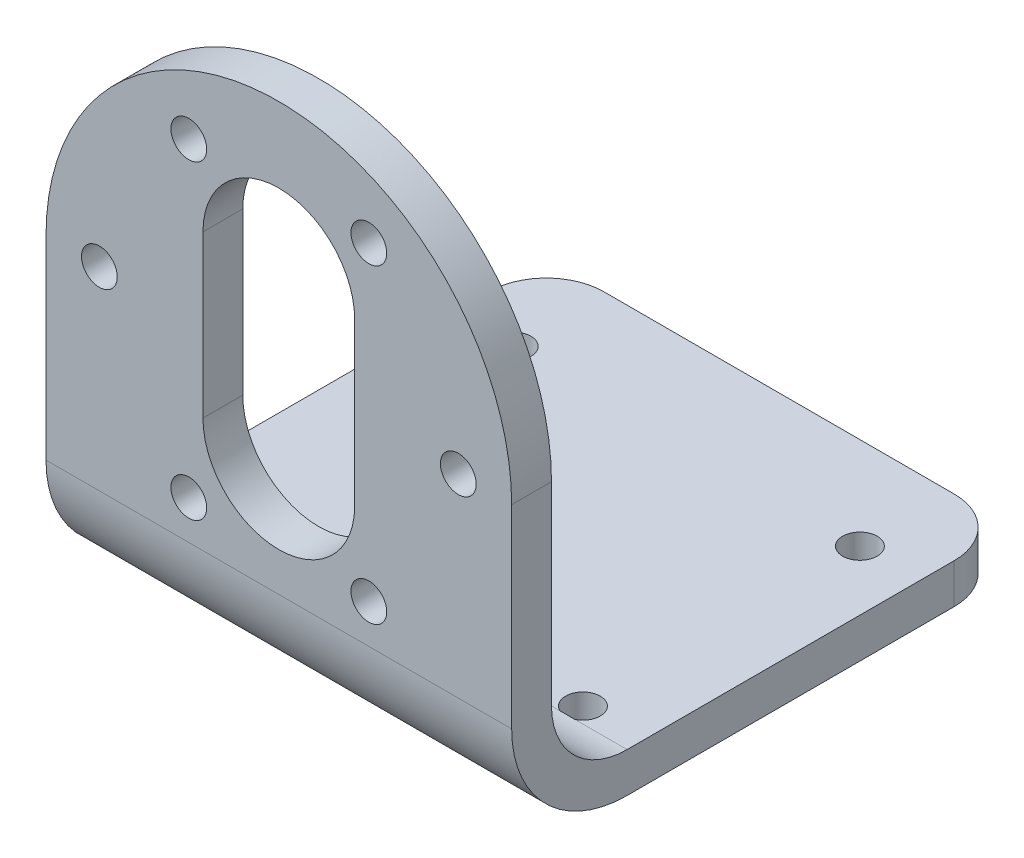
ISO-10303-21;
HEADER;
FILE_DESCRIPTION(('STEP AP214'),'2;1');
FILE_NAME('part.step','',(''),(''),'','','');
FILE_SCHEMA(('AUTOMOTIVE_DESIGN { 1 0 10303 214 1 1 1 1 }'));
ENDSEC;
DATA;
#1=APPLICATION_CONTEXT('core data for automotive mechanical design processes');
#2=APPLICATION_PROTOCOL_DEFINITION('international standard','automotive_design',2000,#1);
#3=PRODUCT_CONTEXT('',#1,'mechanical');
#4=PRODUCT('Part','Part','',(#3));
#5=PRODUCT_RELATED_PRODUCT_CATEGORY('part','',(#4));
#6=PRODUCT_DEFINITION_FORMATION('','',#4);
#7=PRODUCT_DEFINITION_CONTEXT('part definition',#1,'design');
#8=PRODUCT_DEFINITION('design','',#6,#7);
#9=PRODUCT_DEFINITION_SHAPE('','',#8);
#10=(LENGTH_UNIT() NAMED_UNIT(*) SI_UNIT(.MILLI.,.METRE.));
#11=(NAMED_UNIT(*) PLANE_ANGLE_UNIT() SI_UNIT($,.RADIAN.));
#12=(NAMED_UNIT(*) SI_UNIT($,.STERADIAN.) SOLID_ANGLE_UNIT());
#13=UNCERTAINTY_MEASURE_WITH_UNIT(LENGTH_MEASURE(1.E-05),#10,'distance_accuracy_value','');
#14=(GEOMETRIC_REPRESENTATION_CONTEXT(3) GLOBAL_UNCERTAINTY_ASSIGNED_CONTEXT((#13)) GLOBAL_UNIT_ASSIGNED_CONTEXT((#10,
#11,#12)) REPRESENTATION_CONTEXT('',''));
#15=CARTESIAN_POINT('',(0.,0.,0.));
#16=DIRECTION('',(0.,0.,1.));
#17=DIRECTION('',(1.,0.,0.));
#18=AXIS2_PLACEMENT_3D('',#15,#16,#17);
#19=CARTESIAN_POINT('',(-47.1412127925836,47.,50.783023222912));
#20=DIRECTION('',(0.,0.,-1.));
#21=DIRECTION('',(-1.,0.,0.));
#22=AXIS2_PLACEMENT_3D('',#19,#20,#21);
#23=PLANE('',#22);
#24=CARTESIAN_POINT('',(-19.1662127925836,13.3727697016443,50.783023222912));
#25=DIRECTION('',(0.,0.,1.));
#26=DIRECTION('',(1.,0.,0.));
#27=AXIS2_PLACEMENT_3D('',#24,#25,#26);
#28=CIRCLE('',#27,1.55);
#29=CARTESIAN_POINT('',(-17.6162127925836,13.3727697016443,50.783023222912));
#30=VERTEX_POINT('',#29);
#31=EDGE_CURVE('E802',#30,#30,#28,.F.);
#32=ORIENTED_EDGE('',*,*,#31,.T.);
#33=EDGE_LOOP('',(#32));
#34=FACE_BOUND('',#33,.T.);
#35=CARTESIAN_POINT('',(-42.5162127925836,26.825,50.783023222912));
#36=DIRECTION('',(0.,0.,1.));
#37=DIRECTION('',(1.,0.,0.));
#38=AXIS2_PLACEMENT_3D('',#35,#36,#37);
#39=CIRCLE('',#38,1.54999999999999);
#40=CARTESIAN_POINT('',(-40.9662127925836,26.825,50.783023222912));
#41=VERTEX_POINT('',#40);
#42=EDGE_CURVE('E790',#41,#41,#39,.T.);
#43=ORIENTED_EDGE('',*,*,#42,.F.);
#44=EDGE_LOOP('',(#43));
#45=FACE_BOUND('',#44,.T.);
#46=CARTESIAN_POINT('',(-19.1662127925836,40.2772302983557,50.783023222912));
#47=DIRECTION('',(0.,0.,1.));
#48=DIRECTION('',(1.,0.,0.));
#49=AXIS2_PLACEMENT_3D('',#46,#47,#48);
#50=CIRCLE('',#49,1.55);
#51=CARTESIAN_POINT('',(-17.6162127925836,40.2772302983557,50.783023222912));
#52=VERTEX_POINT('',#51);
#53=EDGE_CURVE('E419',#52,#52,#50,.T.);
#54=ORIENTED_EDGE('',*,*,#53,.F.);
#55=EDGE_LOOP('',(#54));
#56=FACE_BOUND('',#55,.T.);
#57=CARTESIAN_POINT('',(-34.7662127925836,13.3727697016443,50.783023222912));
#58=DIRECTION('',(0.,0.,1.));
#59=DIRECTION('',(1.,0.,0.));
#60=AXIS2_PLACEMENT_3D('',#57,#58,#59);
#61=CIRCLE('',#60,1.55);
#62=CARTESIAN_POINT('',(-33.2162127925836,13.3727697016443,50.783023222912));
#63=VERTEX_POINT('',#62);
#64=EDGE_CURVE('E267',#63,#63,#61,.F.);
#65=ORIENTED_EDGE('',*,*,#64,.T.);
#66=EDGE_LOOP('',(#65));
#67=FACE_BOUND('',#66,.T.);
#68=CARTESIAN_POINT('',(-26.9662127925836,19.945,50.783023222912));
#69=DIRECTION('',(0.,0.,1.));
#70=DIRECTION('',(1.,0.,0.));
#71=AXIS2_PLACEMENT_3D('',#68,#69,#70);
#72=CIRCLE('',#71,6.575);
#73=CARTESIAN_POINT('',(-33.5412127925836,19.945,50.783023222912));
#74=VERTEX_POINT('',#73);
#75=CARTESIAN_POINT('',(-20.3912127925836,19.945,50.783023222912));
#76=VERTEX_POINT('',#75);
#77=EDGE_CURVE('E805',#74,#76,#72,.T.);
#78=ORIENTED_EDGE('',*,*,#77,.F.);
#79=DIRECTION('',(0.,-1.,0.));
#80=VECTOR('',#79,1.);
#81=CARTESIAN_POINT('',(-33.5412127925836,0.,50.783023222912));
#82=LINE('',#81,#80);
#83=CARTESIAN_POINT('',(-33.5412127925836,33.925,50.783023222912));
#84=VERTEX_POINT('',#83);
#85=EDGE_CURVE('E286',#84,#74,#82,.T.);
#86=ORIENTED_EDGE('',*,*,#85,.F.);
#87=CARTESIAN_POINT('',(-26.9662127925836,33.925,50.783023222912));
#88=DIRECTION('',(0.,0.,1.));
#89=DIRECTION('',(1.,0.,0.));
#90=AXIS2_PLACEMENT_3D('',#87,#88,#89);
#91=CIRCLE('',#90,6.57500000000001);
#92=CARTESIAN_POINT('',(-20.3912127925836,33.925,50.783023222912));
#93=VERTEX_POINT('',#92);
#94=EDGE_CURVE('E813',#93,#84,#91,.T.);
#95=ORIENTED_EDGE('',*,*,#94,.F.);
#96=DIRECTION('',(0.,-1.,0.));
#97=VECTOR('',#96,1.);
#98=CARTESIAN_POINT('',(-20.3912127925836,0.,50.783023222912));
#99=LINE('',#98,#97);
#100=EDGE_CURVE('E809',#93,#76,#99,.T.);
#101=ORIENTED_EDGE('',*,*,#100,.T.);
#102=EDGE_LOOP('',(#78,#86,#95,#101));
#103=FACE_BOUND('',#102,.T.);
#104=DIRECTION('',(0.,-1.,0.));
#105=VECTOR('',#104,1.);
#106=CARTESIAN_POINT('',(-47.1412127925836,47.,50.783023222912));
#107=LINE('',#106,#105);
#108=CARTESIAN_POINT('',(-47.1412127925836,26.825,50.783023222912));
#109=VERTEX_POINT('',#108);
#110=CARTESIAN_POINT('',(-47.1412127925836,10.,50.783023222912));
#111=VERTEX_POINT('',#110);
#112=EDGE_CURVE('E705',#109,#111,#107,.T.);
#113=ORIENTED_EDGE('',*,*,#112,.T.);
#114=DIRECTION('',(1.,0.,0.));
#115=VECTOR('',#114,1.);
#116=CARTESIAN_POINT('',(-47.1412127925836,10.,50.783023222912));
#117=LINE('',#116,#115);
#118=CARTESIAN_POINT('',(-6.79121279258359,10.,50.783023222912));
#119=VERTEX_POINT('',#118);
#120=EDGE_CURVE('E204',#111,#119,#117,.T.);
#121=ORIENTED_EDGE('',*,*,#120,.T.);
#122=DIRECTION('',(0.,-1.,0.));
#123=VECTOR('',#122,1.);
#124=CARTESIAN_POINT('',(-6.79121279258359,47.,50.783023222912));
#125=LINE('',#124,#123);
#126=CARTESIAN_POINT('',(-6.79121279258359,26.825,50.783023222912));
#127=VERTEX_POINT('',#126);
#128=EDGE_CURVE('E699',#127,#119,#125,.T.);
#129=ORIENTED_EDGE('',*,*,#128,.F.);
#130=CARTESIAN_POINT('',(-26.9662127925836,26.825,50.783023222912));
#131=DIRECTION('',(0.,0.,1.));
#132=DIRECTION('',(1.,0.,0.));
#133=AXIS2_PLACEMENT_3D('',#130,#131,#132);
#134=CIRCLE('',#133,20.175);
#135=EDGE_CURVE('E729',#127,#109,#134,.T.);
#136=ORIENTED_EDGE('',*,*,#135,.T.);
#137=EDGE_LOOP('',(#113,#121,#129,#136));
#138=FACE_BOUND('',#137,.T.);
#139=CARTESIAN_POINT('',(-34.7662127925836,40.2772302983557,50.783023222912));
#140=DIRECTION('',(0.,0.,1.));
#141=DIRECTION('',(1.,0.,0.));
#142=AXIS2_PLACEMENT_3D('',#139,#140,#141);
#143=CIRCLE('',#142,1.55);
#144=CARTESIAN_POINT('',(-33.2162127925836,40.2772302983557,50.783023222912));
#145=VERTEX_POINT('',#144);
#146=EDGE_CURVE('E786',#145,#145,#143,.T.);
#147=ORIENTED_EDGE('',*,*,#146,.F.);
#148=EDGE_LOOP('',(#147));
#149=FACE_BOUND('',#148,.T.);
#150=CARTESIAN_POINT('',(-11.4162127925836,26.825,50.783023222912));
#151=DIRECTION('',(0.,0.,1.));
#152=DIRECTION('',(1.,0.,0.));
#153=AXIS2_PLACEMENT_3D('',#150,#151,#152);
#154=CIRCLE('',#153,1.55);
#155=CARTESIAN_POINT('',(-9.8662127925836,26.825,50.783023222912));
#156=VERTEX_POINT('',#155);
#157=EDGE_CURVE('E795',#156,#156,#154,.T.);
#158=ORIENTED_EDGE('',*,*,#157,.F.);
#159=EDGE_LOOP('',(#158));
#160=FACE_BOUND('',#159,.T.);
#161=ADVANCED_FACE('F43',(#34,#45,#56,#67,#103,#138,#149,#160),#23,.F.);
#162=CARTESIAN_POINT('',(54.8587872074164,0.,47.3330232229119));
#163=DIRECTION('',(0.,0.,1.));
#164=DIRECTION('',(1.,0.,0.));
#165=AXIS2_PLACEMENT_3D('',#162,#163,#164);
#166=PLANE('',#165);
#167=CARTESIAN_POINT('',(-19.1662127925836,13.3727697016443,47.333023222912));
#168=DIRECTION('',(0.,0.,1.));
#169=DIRECTION('',(1.,0.,0.));
#170=AXIS2_PLACEMENT_3D('',#167,#168,#169);
#171=CIRCLE('',#170,1.55);
#172=CARTESIAN_POINT('',(-17.6162127925836,13.3727697016443,47.333023222912));
#173=VERTEX_POINT('',#172);
#174=EDGE_CURVE('E283',#173,#173,#171,.F.);
#175=ORIENTED_EDGE('',*,*,#174,.F.);
#176=EDGE_LOOP('',(#175));
#177=FACE_BOUND('',#176,.T.);
#178=CARTESIAN_POINT('',(-42.5162127925836,26.825,47.333023222912));
#179=DIRECTION('',(0.,0.,1.));
#180=DIRECTION('',(1.,0.,0.));
#181=AXIS2_PLACEMENT_3D('',#178,#179,#180);
#182=CIRCLE('',#181,1.54999999999999);
#183=CARTESIAN_POINT('',(-40.9662127925836,26.825,47.333023222912));
#184=VERTEX_POINT('',#183);
#185=EDGE_CURVE('E275',#184,#184,#182,.T.);
#186=ORIENTED_EDGE('',*,*,#185,.T.);
#187=EDGE_LOOP('',(#186));
#188=FACE_BOUND('',#187,.T.);
#189=CARTESIAN_POINT('',(-19.1662127925836,40.2772302983557,47.333023222912));
#190=DIRECTION('',(0.,0.,1.));
#191=DIRECTION('',(1.,0.,0.));
#192=AXIS2_PLACEMENT_3D('',#189,#190,#191);
#193=CIRCLE('',#192,1.55);
#194=CARTESIAN_POINT('',(-17.6162127925836,40.2772302983557,47.333023222912));
#195=VERTEX_POINT('',#194);
#196=EDGE_CURVE('E266',#195,#195,#193,.T.);
#197=ORIENTED_EDGE('',*,*,#196,.T.);
#198=EDGE_LOOP('',(#197));
#199=FACE_BOUND('',#198,.T.);
#200=CARTESIAN_POINT('',(-34.7662127925836,13.3727697016443,47.333023222912));
#201=DIRECTION('',(0.,0.,1.));
#202=DIRECTION('',(1.,0.,0.));
#203=AXIS2_PLACEMENT_3D('',#200,#201,#202);
#204=CIRCLE('',#203,1.55);
#205=CARTESIAN_POINT('',(-33.2162127925836,13.3727697016443,47.333023222912));
#206=VERTEX_POINT('',#205);
#207=EDGE_CURVE('E262',#206,#206,#204,.F.);
#208=ORIENTED_EDGE('',*,*,#207,.F.);
#209=EDGE_LOOP('',(#208));
#210=FACE_BOUND('',#209,.T.);
#211=CARTESIAN_POINT('',(-26.9662127925836,33.925,47.333023222912));
#212=DIRECTION('',(0.,0.,1.));
#213=DIRECTION('',(1.,0.,0.));
#214=AXIS2_PLACEMENT_3D('',#211,#212,#213);
#215=CIRCLE('',#214,6.57500000000001);
#216=CARTESIAN_POINT('',(-20.3912127925836,33.925,47.333023222912));
#217=VERTEX_POINT('',#216);
#218=CARTESIAN_POINT('',(-33.5412127925836,33.925,47.333023222912));
#219=VERTEX_POINT('',#218);
#220=EDGE_CURVE('E54',#217,#219,#215,.T.);
#221=ORIENTED_EDGE('',*,*,#220,.T.);
#222=DIRECTION('',(0.,-1.,0.));
#223=VECTOR('',#222,1.);
#224=CARTESIAN_POINT('',(-33.5412127925836,0.,47.333023222912));
#225=LINE('',#224,#223);
#226=CARTESIAN_POINT('',(-33.5412127925836,19.945,47.333023222912));
#227=VERTEX_POINT('',#226);
#228=EDGE_CURVE('E11',#219,#227,#225,.T.);
#229=ORIENTED_EDGE('',*,*,#228,.T.);
#230=CARTESIAN_POINT('',(-26.9662127925836,19.945,47.333023222912));
#231=DIRECTION('',(0.,0.,1.));
#232=DIRECTION('',(1.,0.,0.));
#233=AXIS2_PLACEMENT_3D('',#230,#231,#232);
#234=CIRCLE('',#233,6.575);
#235=CARTESIAN_POINT('',(-20.3912127925836,19.945,47.333023222912));
#236=VERTEX_POINT('',#235);
#237=EDGE_CURVE('E251',#227,#236,#234,.T.);
#238=ORIENTED_EDGE('',*,*,#237,.T.);
#239=DIRECTION('',(0.,-1.,0.));
#240=VECTOR('',#239,1.);
#241=CARTESIAN_POINT('',(-20.3912127925836,0.,47.333023222912));
#242=LINE('',#241,#240);
#243=EDGE_CURVE('E255',#217,#236,#242,.T.);
#244=ORIENTED_EDGE('',*,*,#243,.F.);
#245=EDGE_LOOP('',(#221,#229,#238,#244));
#246=FACE_BOUND('',#245,.T.);
#247=DIRECTION('',(-1.,0.,0.));
#248=VECTOR('',#247,1.);
#249=CARTESIAN_POINT('',(54.8587872074164,10.,47.3330232229119));
#250=LINE('',#249,#248);
#251=CARTESIAN_POINT('',(-6.79121279258359,10.,47.333023222912));
#252=VERTEX_POINT('',#251);
#253=CARTESIAN_POINT('',(-47.1412127925836,10.,47.333023222912));
#254=VERTEX_POINT('',#253);
#255=EDGE_CURVE('E686',#252,#254,#250,.T.);
#256=ORIENTED_EDGE('',*,*,#255,.T.);
#257=DIRECTION('',(0.,1.,0.));
#258=VECTOR('',#257,1.);
#259=CARTESIAN_POINT('',(-47.1412127925836,0.,47.333023222912));
#260=LINE('',#259,#258);
#261=CARTESIAN_POINT('',(-47.1412127925836,26.825,47.333023222912));
#262=VERTEX_POINT('',#261);
#263=EDGE_CURVE('E687',#254,#262,#260,.T.);
#264=ORIENTED_EDGE('',*,*,#263,.T.);
#265=CARTESIAN_POINT('',(-26.9662127925836,26.825,47.333023222912));
#266=DIRECTION('',(0.,0.,1.));
#267=DIRECTION('',(1.,0.,0.));
#268=AXIS2_PLACEMENT_3D('',#265,#266,#267);
#269=CIRCLE('',#268,20.175);
#270=CARTESIAN_POINT('',(-6.79121279258359,26.825,47.333023222912));
#271=VERTEX_POINT('',#270);
#272=EDGE_CURVE('E215',#262,#271,#269,.F.);
#273=ORIENTED_EDGE('',*,*,#272,.T.);
#274=DIRECTION('',(0.,1.,0.));
#275=VECTOR('',#274,1.);
#276=CARTESIAN_POINT('',(-6.7912127925836,47.,47.333023222912));
#277=LINE('',#276,#275);
#278=EDGE_CURVE('E727',#252,#271,#277,.T.);
#279=ORIENTED_EDGE('',*,*,#278,.F.);
#280=EDGE_LOOP('',(#256,#264,#273,#279));
#281=FACE_BOUND('',#280,.T.);
#282=CARTESIAN_POINT('',(-34.7662127925836,40.2772302983557,47.333023222912));
#283=DIRECTION('',(0.,0.,1.));
#284=DIRECTION('',(1.,0.,0.));
#285=AXIS2_PLACEMENT_3D('',#282,#283,#284);
#286=CIRCLE('',#285,1.55);
#287=CARTESIAN_POINT('',(-33.2162127925836,40.2772302983557,47.333023222912));
#288=VERTEX_POINT('',#287);
#289=EDGE_CURVE('E271',#288,#288,#286,.T.);
#290=ORIENTED_EDGE('',*,*,#289,.T.);
#291=EDGE_LOOP('',(#290));
#292=FACE_BOUND('',#291,.T.);
#293=CARTESIAN_POINT('',(-11.4162127925836,26.825,47.333023222912));
#294=DIRECTION('',(0.,0.,1.));
#295=DIRECTION('',(1.,0.,0.));
#296=AXIS2_PLACEMENT_3D('',#293,#294,#295);
#297=CIRCLE('',#296,1.55);
#298=CARTESIAN_POINT('',(-9.8662127925836,26.825,47.333023222912));
#299=VERTEX_POINT('',#298);
#300=EDGE_CURVE('E279',#299,#299,#297,.T.);
#301=ORIENTED_EDGE('',*,*,#300,.T.);
#302=EDGE_LOOP('',(#301));
#303=FACE_BOUND('',#302,.T.);
#304=ADVANCED_FACE('F324',(#177,#188,#199,#210,#246,#281,#292,#303),#166,.F.);
#305=CARTESIAN_POINT('',(-47.1412127925836,47.,7.43302322291196));
#306=DIRECTION('',(0.,0.,1.));
#307=DIRECTION('',(1.,0.,0.));
#308=AXIS2_PLACEMENT_3D('',#305,#306,#307);
#309=PLANE('',#308);
#310=DIRECTION('',(1.,0.,0.));
#311=VECTOR('',#310,1.);
#312=CARTESIAN_POINT('',(-47.1412127925836,3.45,7.43302322291196));
#313=LINE('',#312,#311);
#314=CARTESIAN_POINT('',(-42.1412127925836,3.45,7.43302322291196));
#315=VERTEX_POINT('',#314);
#316=CARTESIAN_POINT('',(-11.7912127925836,3.45,7.43302322291196));
#317=VERTEX_POINT('',#316);
#318=EDGE_CURVE('E733',#315,#317,#313,.T.);
#319=ORIENTED_EDGE('',*,*,#318,.T.);
#320=DIRECTION('',(0.,-1.,0.));
#321=VECTOR('',#320,1.);
#322=CARTESIAN_POINT('',(-11.7912127925836,47.,7.43302322291196));
#323=LINE('',#322,#321);
#324=CARTESIAN_POINT('',(-11.7912127925836,0.,7.43302322291196));
#325=VERTEX_POINT('',#324);
#326=EDGE_CURVE('E228',#317,#325,#323,.T.);
#327=ORIENTED_EDGE('',*,*,#326,.T.);
#328=DIRECTION('',(-1.,0.,0.));
#329=VECTOR('',#328,1.);
#330=CARTESIAN_POINT('',(-47.1412127925836,0.,7.43302322291196));
#331=LINE('',#330,#329);
#332=CARTESIAN_POINT('',(-42.1412127925836,0.,7.43302322291196));
#333=VERTEX_POINT('',#332);
#334=EDGE_CURVE('E693',#325,#333,#331,.T.);
#335=ORIENTED_EDGE('',*,*,#334,.T.);
#336=DIRECTION('',(0.,-1.,0.));
#337=VECTOR('',#336,1.);
#338=CARTESIAN_POINT('',(-42.1412127925836,47.,7.43302322291196));
#339=LINE('',#338,#337);
#340=EDGE_CURVE('E225',#333,#315,#339,.F.);
#341=ORIENTED_EDGE('',*,*,#340,.T.);
#342=EDGE_LOOP('',(#319,#327,#335,#341));
#343=FACE_BOUND('',#342,.T.);
#344=ADVANCED_FACE('F329',(#343),#309,.F.);
#345=CARTESIAN_POINT('',(-47.1412127925836,47.,7.43302322291196));
#346=DIRECTION('',(1.,0.,0.));
#347=DIRECTION('',(0.,0.,-1.));
#348=AXIS2_PLACEMENT_3D('',#345,#346,#347);
#349=PLANE('',#348);
#350=DIRECTION('',(0.,0.,1.));
#351=VECTOR('',#350,1.);
#352=CARTESIAN_POINT('',(-47.1412127925836,3.45,0.));
#353=LINE('',#352,#351);
#354=CARTESIAN_POINT('',(-47.1412127925836,3.45,12.433023222912));
#355=VERTEX_POINT('',#354);
#356=CARTESIAN_POINT('',(-47.1412127925836,3.45,40.783023222912));
#357=VERTEX_POINT('',#356);
#358=EDGE_CURVE('E678',#355,#357,#353,.T.);
#359=ORIENTED_EDGE('',*,*,#358,.F.);
#360=DIRECTION('',(0.,-1.,0.));
#361=VECTOR('',#360,1.);
#362=CARTESIAN_POINT('',(-47.1412127925836,47.,12.433023222912));
#363=LINE('',#362,#361);
#364=CARTESIAN_POINT('',(-47.1412127925836,0.,12.433023222912));
#365=VERTEX_POINT('',#364);
#366=EDGE_CURVE('E247',#355,#365,#363,.T.);
#367=ORIENTED_EDGE('',*,*,#366,.T.);
#368=DIRECTION('',(0.,0.,1.));
#369=VECTOR('',#368,1.);
#370=CARTESIAN_POINT('',(-47.1412127925836,0.,7.43302322291196));
#371=LINE('',#370,#369);
#372=CARTESIAN_POINT('',(-47.1412127925836,0.,40.783023222912));
#373=VERTEX_POINT('',#372);
#374=EDGE_CURVE('E694',#365,#373,#371,.T.);
#375=ORIENTED_EDGE('',*,*,#374,.T.);
#376=CARTESIAN_POINT('',(-47.1412127925836,10.,40.783023222912));
#377=DIRECTION('',(1.,0.,0.));
#378=DIRECTION('',(0.,0.,-1.));
#379=AXIS2_PLACEMENT_3D('',#376,#377,#378);
#380=CIRCLE('',#379,10.);
#381=EDGE_CURVE('E197',#373,#111,#380,.F.);
#382=ORIENTED_EDGE('',*,*,#381,.T.);
#383=ORIENTED_EDGE('',*,*,#112,.F.);
#384=DIRECTION('',(0.,0.,1.));
#385=VECTOR('',#384,1.);
#386=CARTESIAN_POINT('',(-47.1412127925836,26.825,-51.216976777088));
#387=LINE('',#386,#385);
#388=EDGE_CURVE('E731',#262,#109,#387,.T.);
#389=ORIENTED_EDGE('',*,*,#388,.F.);
#390=ORIENTED_EDGE('',*,*,#263,.F.);
#391=CARTESIAN_POINT('',(-47.1412127925836,10.,40.783023222912));
#392=DIRECTION('',(-1.,0.,0.));
#393=DIRECTION('',(0.,0.,1.));
#394=AXIS2_PLACEMENT_3D('',#391,#392,#393);
#395=CIRCLE('',#394,6.55);
#396=EDGE_CURVE('E682',#357,#254,#395,.T.);
#397=ORIENTED_EDGE('',*,*,#396,.F.);
#398=EDGE_LOOP('',(#359,#367,#375,#382,#383,#389,#390,#397));
#399=FACE_BOUND('',#398,.T.);
#400=ADVANCED_FACE('F300',(#399),#349,.F.);
#401=CARTESIAN_POINT('',(-6.7912127925836,47.,7.43302322291196));
#402=DIRECTION('',(-1.,0.,0.));
#403=DIRECTION('',(0.,0.,1.));
#404=AXIS2_PLACEMENT_3D('',#401,#402,#403);
#405=PLANE('',#404);
#406=DIRECTION('',(0.,0.,-1.));
#407=VECTOR('',#406,1.);
#408=CARTESIAN_POINT('',(-6.7912127925836,0.,7.43302322291196));
#409=LINE('',#408,#407);
#410=CARTESIAN_POINT('',(-6.7912127925836,0.,40.783023222912));
#411=VERTEX_POINT('',#410);
#412=CARTESIAN_POINT('',(-6.7912127925836,0.,12.433023222912));
#413=VERTEX_POINT('',#412);
#414=EDGE_CURVE('E700',#411,#413,#409,.T.);
#415=ORIENTED_EDGE('',*,*,#414,.T.);
#416=DIRECTION('',(0.,-1.,0.));
#417=VECTOR('',#416,1.);
#418=CARTESIAN_POINT('',(-6.7912127925836,47.,12.433023222912));
#419=LINE('',#418,#417);
#420=CARTESIAN_POINT('',(-6.7912127925836,3.45,12.433023222912));
#421=VERTEX_POINT('',#420);
#422=EDGE_CURVE('E238',#413,#421,#419,.F.);
#423=ORIENTED_EDGE('',*,*,#422,.T.);
#424=DIRECTION('',(0.,0.,1.));
#425=VECTOR('',#424,1.);
#426=CARTESIAN_POINT('',(-6.7912127925836,3.45,7.43302322291196));
#427=LINE('',#426,#425);
#428=CARTESIAN_POINT('',(-6.7912127925836,3.45,40.783023222912));
#429=VERTEX_POINT('',#428);
#430=EDGE_CURVE('E222',#421,#429,#427,.T.);
#431=ORIENTED_EDGE('',*,*,#430,.T.);
#432=CARTESIAN_POINT('',(-6.79121279258359,10.,40.783023222912));
#433=DIRECTION('',(-1.,0.,0.));
#434=DIRECTION('',(0.,0.,1.));
#435=AXIS2_PLACEMENT_3D('',#432,#433,#434);
#436=CIRCLE('',#435,6.55);
#437=EDGE_CURVE('E218',#429,#252,#436,.T.);
#438=ORIENTED_EDGE('',*,*,#437,.T.);
#439=ORIENTED_EDGE('',*,*,#278,.T.);
#440=DIRECTION('',(0.,0.,1.));
#441=VECTOR('',#440,1.);
#442=CARTESIAN_POINT('',(-6.7912127925836,26.825,-51.216976777088));
#443=LINE('',#442,#441);
#444=EDGE_CURVE('E714',#271,#127,#443,.T.);
#445=ORIENTED_EDGE('',*,*,#444,.T.);
#446=ORIENTED_EDGE('',*,*,#128,.T.);
#447=CARTESIAN_POINT('',(-6.79121279258359,10.,40.783023222912));
#448=DIRECTION('',(-1.,0.,0.));
#449=DIRECTION('',(0.,0.,1.));
#450=AXIS2_PLACEMENT_3D('',#447,#448,#449);
#451=CIRCLE('',#450,10.);
#452=EDGE_CURVE('E199',#119,#411,#451,.F.);
#453=ORIENTED_EDGE('',*,*,#452,.T.);
#454=EDGE_LOOP('',(#415,#423,#431,#438,#439,#445,#446,#453));
#455=FACE_BOUND('',#454,.T.);
#456=ADVANCED_FACE('F335',(#455),#405,.F.);
#457=CARTESIAN_POINT('',(0.,0.,0.));
#458=DIRECTION('',(0.,1.,0.));
#459=DIRECTION('',(0.,0.,1.));
#460=AXIS2_PLACEMENT_3D('',#457,#458,#459);
#461=PLANE('',#460);
#462=CARTESIAN_POINT('',(-41.9662127925836,0.,15.433023222912));
#463=DIRECTION('',(0.,1.,0.));
#464=DIRECTION('',(0.,0.,1.));
#465=AXIS2_PLACEMENT_3D('',#462,#463,#464);
#466=CIRCLE('',#465,1.5);
#467=CARTESIAN_POINT('',(-41.9662127925836,0.,16.933023222912));
#468=VERTEX_POINT('',#467);
#469=EDGE_CURVE('E435',#468,#468,#466,.T.);
#470=ORIENTED_EDGE('',*,*,#469,.T.);
#471=EDGE_LOOP('',(#470));
#472=FACE_BOUND('',#471,.T.);
#473=CARTESIAN_POINT('',(-11.9662127925836,0.,15.433023222912));
#474=DIRECTION('',(0.,1.,0.));
#475=DIRECTION('',(0.,0.,1.));
#476=AXIS2_PLACEMENT_3D('',#473,#474,#475);
#477=CIRCLE('',#476,1.5);
#478=CARTESIAN_POINT('',(-11.9662127925836,0.,16.933023222912));
#479=VERTEX_POINT('',#478);
#480=EDGE_CURVE('E180',#479,#479,#477,.T.);
#481=ORIENTED_EDGE('',*,*,#480,.T.);
#482=EDGE_LOOP('',(#481));
#483=FACE_BOUND('',#482,.T.);
#484=DIRECTION('',(1.,0.,0.));
#485=VECTOR('',#484,1.);
#486=CARTESIAN_POINT('',(0.,0.,40.783023222912));
#487=LINE('',#486,#485);
#488=CARTESIAN_POINT('',(-11.3123779510525,0.,40.783023222912));
#489=VERTEX_POINT('',#488);
#490=EDGE_CURVE('E47',#411,#489,#487,.F.);
#491=ORIENTED_EDGE('',*,*,#490,.T.);
#492=CARTESIAN_POINT('',(-11.9662127925836,0.,39.433023222912));
#493=DIRECTION('',(0.,1.,0.));
#494=DIRECTION('',(0.,0.,1.));
#495=AXIS2_PLACEMENT_3D('',#492,#493,#494);
#496=CIRCLE('',#495,1.5);
#497=CARTESIAN_POINT('',(-12.6200476341147,0.,40.783023222912));
#498=VERTEX_POINT('',#497);
#499=EDGE_CURVE('E68',#489,#498,#496,.T.);
#500=ORIENTED_EDGE('',*,*,#499,.T.);
#501=CARTESIAN_POINT('',(-41.3123779510525,0.,40.783023222912));
#502=VERTEX_POINT('',#501);
#503=EDGE_CURVE('E189',#498,#502,#487,.F.);
#504=ORIENTED_EDGE('',*,*,#503,.T.);
#505=CARTESIAN_POINT('',(-41.9662127925836,0.,39.433023222912));
#506=DIRECTION('',(0.,1.,0.));
#507=DIRECTION('',(0.,0.,1.));
#508=AXIS2_PLACEMENT_3D('',#505,#506,#507);
#509=CIRCLE('',#508,1.5);
#510=CARTESIAN_POINT('',(-42.6200476341147,0.,40.783023222912));
#511=VERTEX_POINT('',#510);
#512=EDGE_CURVE('E61',#502,#511,#509,.T.);
#513=ORIENTED_EDGE('',*,*,#512,.T.);
#514=EDGE_CURVE('E187',#511,#373,#487,.F.);
#515=ORIENTED_EDGE('',*,*,#514,.T.);
#516=ORIENTED_EDGE('',*,*,#374,.F.);
#517=CARTESIAN_POINT('',(-42.1412127925836,0.,12.433023222912));
#518=DIRECTION('',(0.,1.,0.));
#519=DIRECTION('',(0.,0.,1.));
#520=AXIS2_PLACEMENT_3D('',#517,#518,#519);
#521=CIRCLE('',#520,5.);
#522=EDGE_CURVE('E232',#365,#333,#521,.F.);
#523=ORIENTED_EDGE('',*,*,#522,.T.);
#524=ORIENTED_EDGE('',*,*,#334,.F.);
#525=CARTESIAN_POINT('',(-11.7912127925836,0.,12.433023222912));
#526=DIRECTION('',(0.,1.,0.));
#527=DIRECTION('',(0.,0.,1.));
#528=AXIS2_PLACEMENT_3D('',#525,#526,#527);
#529=CIRCLE('',#528,5.);
#530=EDGE_CURVE('E235',#325,#413,#529,.F.);
#531=ORIENTED_EDGE('',*,*,#530,.T.);
#532=ORIENTED_EDGE('',*,*,#414,.F.);
#533=EDGE_LOOP('',(#491,#500,#504,#513,#515,#516,#523,#524,#531,#532));
#534=FACE_BOUND('',#533,.T.);
#535=ADVANCED_FACE('F185',(#472,#483,#534),#461,.F.);
#536=CARTESIAN_POINT('',(-26.9662127925836,26.825,-51.216976777088));
#537=DIRECTION('',(0.,0.,1.));
#538=DIRECTION('',(1.,0.,0.));
#539=AXIS2_PLACEMENT_3D('',#536,#537,#538);
#540=CYLINDRICAL_SURFACE('',#539,20.175);
#541=ORIENTED_EDGE('',*,*,#272,.F.);
#542=ORIENTED_EDGE('',*,*,#388,.T.);
#543=ORIENTED_EDGE('',*,*,#135,.F.);
#544=ORIENTED_EDGE('',*,*,#444,.F.);
#545=EDGE_LOOP('',(#541,#542,#543,#544));
#546=FACE_BOUND('',#545,.T.);
#547=ADVANCED_FACE('F299',(#546),#540,.T.);
#548=CARTESIAN_POINT('',(-47.1412127925836,10.,40.783023222912));
#549=DIRECTION('',(1.,0.,0.));
#550=DIRECTION('',(0.,0.,-1.));
#551=AXIS2_PLACEMENT_3D('',#548,#549,#550);
#552=CYLINDRICAL_SURFACE('',#551,10.);
#553=CARTESIAN_POINT('',(-12.6200476341147,0.,40.783023222912));
#554=CARTESIAN_POINT('',(-12.5943677017575,1.72127722950147E-07,40.7954641833504));
#555=CARTESIAN_POINT('',(-12.5683455877157,2.32307208614604E-05,40.8072045191123));
#556=CARTESIAN_POINT('',(-12.5159373171867,0.00010019440227988,40.8291055916999));
#557=CARTESIAN_POINT('',(-12.4895570150316,0.00015380264204566,40.8392803499427));
#558=CARTESIAN_POINT('',(-12.4364321358905,0.000277096536907785,40.8580512337616));
#559=CARTESIAN_POINT('',(-12.4096910318509,0.00034667564709568,40.8666571713151));
#560=CARTESIAN_POINT('',(-12.3558477349578,0.000489710263555879,40.8822956354544));
#561=CARTESIAN_POINT('',(-12.3287470169743,0.000563152284022781,40.8893332381768));
#562=CARTESIAN_POINT('',(-12.2741862254217,0.000703937254228669,40.9018397854064));
#563=CARTESIAN_POINT('',(-12.2467261552222,0.000771280261109108,40.9073087446114));
#564=CARTESIAN_POINT('',(-12.1914481235152,0.000892187139675542,40.9166832948669));
#565=CARTESIAN_POINT('',(-12.163629284005,0.000945705127631314,40.920583703319));
#566=CARTESIAN_POINT('',(-12.107634383126,0.00103353063030777,40.9268264100361));
#567=CARTESIAN_POINT('',(-12.0794571752126,0.00106771079843614,40.929158398224));
#568=CARTESIAN_POINT('',(-12.0227460011304,0.00111366262040382,40.932269459116));
#569=CARTESIAN_POINT('',(-11.9942112124553,0.00112521530940323,40.9330333609074));
#570=CARTESIAN_POINT('',(-11.9371884343801,0.00112490864177874,40.9330129099059));
#571=CARTESIAN_POINT('',(-11.9087004440503,0.00111308718153955,40.9322310632269));
#572=CARTESIAN_POINT('',(-11.8520822823952,0.00106669853368952,40.9290892843334));
#573=CARTESIAN_POINT('',(-11.8239512843018,0.00103234868138432,40.9267444272537));
#574=CARTESIAN_POINT('',(-11.7680482209492,0.000944292460009343,40.9204812123427));
#575=CARTESIAN_POINT('',(-11.7402750108851,0.000890712329226525,40.9165730978799));
#576=CARTESIAN_POINT('',(-11.6850876474165,0.000769781650637694,40.9071883112858));
#577=CARTESIAN_POINT('',(-11.6576726193463,0.000702476508607985,40.9017167879533));
#578=CARTESIAN_POINT('',(-11.6032013210822,0.000561845593689884,40.889210260816));
#579=CARTESIAN_POINT('',(-11.5761450542456,0.000488519764504759,40.8821752423907));
#580=CARTESIAN_POINT('',(-11.5223900741481,0.00034575933776588,40.8665470585984));
#581=CARTESIAN_POINT('',(-11.495692827584,0.000276338315515777,40.8579488501747));
#582=CARTESIAN_POINT('',(-11.4426550818672,0.000153352386072352,40.8391985083975));
#583=CARTESIAN_POINT('',(-11.4163180350936,9.98936090747963E-05,40.8290366264128));
#584=CARTESIAN_POINT('',(-11.3639957266154,2.31553988173843E-05,40.8071663455735));
#585=CARTESIAN_POINT('',(-11.3380162834656,1.71130413424761E-07,40.7954440143162));
#586=CARTESIAN_POINT('',(-11.3123779510525,0.,40.783023222912));
#587=B_SPLINE_CURVE_WITH_KNOTS('',3,(#553,#554,#555,#556,#557,#558,#559,#560,#561,#562,#563,
#564,#565,#566,#567,#568,#569,#570,#571,#572,#573,#574,#575,#576,#577,#578,#579,#580,#581,#582,
#583,#584,#585,#586),.UNSPECIFIED.,.F.,.F.,(4,2,2,2,2,2,2,2,2,2,2,2,2,2,2,2,4),(0.,
0.0855975175499067,0.170377137006113,0.254606817264613,0.338559783578439,0.42251196325835,
0.506739291576534,0.591515017287527,0.677107137222739,0.762560600890821,0.847201572113477,
0.931296781289634,1.01511816891967,1.09894034041502,1.18303789327986,1.26768274467184,
1.35314158730682),.UNSPECIFIED.);
#588=EDGE_CURVE('E179',#498,#489,#587,.T.);
#589=ORIENTED_EDGE('',*,*,#588,.T.);
#590=ORIENTED_EDGE('',*,*,#490,.F.);
#591=ORIENTED_EDGE('',*,*,#452,.F.);
#592=ORIENTED_EDGE('',*,*,#120,.F.);
#593=ORIENTED_EDGE('',*,*,#381,.F.);
#594=ORIENTED_EDGE('',*,*,#514,.F.);
#595=CARTESIAN_POINT('',(-42.6200476341147,0.,40.783023222912));
#596=CARTESIAN_POINT('',(-42.5943677017575,1.72127722971925E-07,40.7954641833504));
#597=CARTESIAN_POINT('',(-42.5683455877157,2.32307208614748E-05,40.8072045191123));
#598=CARTESIAN_POINT('',(-42.5159373171867,0.000100194402279875,40.8291055916999));
#599=CARTESIAN_POINT('',(-42.4895570150316,0.000153802642045649,40.8392803499427));
#600=CARTESIAN_POINT('',(-42.4364321358905,0.000277096536907782,40.8580512337616));
#601=CARTESIAN_POINT('',(-42.4096910318509,0.000346675647095686,40.8666571713151));
#602=CARTESIAN_POINT('',(-42.3558477349578,0.000489710263555884,40.8822956354544));
#603=CARTESIAN_POINT('',(-42.3287470169743,0.000563152284022776,40.8893332381768));
#604=CARTESIAN_POINT('',(-42.2741862254217,0.000703937254228662,40.9018397854064));
#605=CARTESIAN_POINT('',(-42.2467261552222,0.00077128026110911,40.9073087446114));
#606=CARTESIAN_POINT('',(-42.1914481235152,0.00089218713967555,40.9166832948669));
#607=CARTESIAN_POINT('',(-42.163629284005,0.000945705127631315,40.920583703319));
#608=CARTESIAN_POINT('',(-42.107634383126,0.00103353063030776,40.9268264100361));
#609=CARTESIAN_POINT('',(-42.0794571752126,0.00106771079843614,40.929158398224));
#610=CARTESIAN_POINT('',(-42.0227460011304,0.00111366262040382,40.932269459116));
#611=CARTESIAN_POINT('',(-41.9942112124553,0.00112521530940323,40.9330333609074));
#612=CARTESIAN_POINT('',(-41.9371884343801,0.00112490864177874,40.9330129099059));
#613=CARTESIAN_POINT('',(-41.9087004440503,0.00111308718153955,40.9322310632269));
#614=CARTESIAN_POINT('',(-41.8520822823951,0.00106669853368952,40.9290892843334));
#615=CARTESIAN_POINT('',(-41.8239512843018,0.00103234868138432,40.9267444272537));
#616=CARTESIAN_POINT('',(-41.7680482209492,0.000944292460009343,40.9204812123427));
#617=CARTESIAN_POINT('',(-41.7402750108851,0.000890712329226524,40.9165730978799));
#618=CARTESIAN_POINT('',(-41.6850876474165,0.000769781650637695,40.9071883112858));
#619=CARTESIAN_POINT('',(-41.6576726193463,0.000702476508607988,40.9017167879533));
#620=CARTESIAN_POINT('',(-41.6032013210822,0.000561845593689886,40.889210260816));
#621=CARTESIAN_POINT('',(-41.5761450542456,0.000488519764504757,40.8821752423907));
#622=CARTESIAN_POINT('',(-41.5223900741481,0.000345759337765877,40.8665470585984));
#623=CARTESIAN_POINT('',(-41.495692827584,0.000276338315515776,40.8579488501747));
#624=CARTESIAN_POINT('',(-41.4426550818672,0.000153352386072353,40.8391985083975));
#625=CARTESIAN_POINT('',(-41.4163180350936,9.98936090747969E-05,40.8290366264128));
#626=CARTESIAN_POINT('',(-41.3639957266153,2.31553988173838E-05,40.8071663455735));
#627=CARTESIAN_POINT('',(-41.3380162834656,1.71130413423628E-07,40.7954440143162));
#628=CARTESIAN_POINT('',(-41.3123779510525,0.,40.783023222912));
#629=B_SPLINE_CURVE_WITH_KNOTS('',3,(#595,#596,#597,#598,#599,#600,#601,#602,#603,#604,#605,
#606,#607,#608,#609,#610,#611,#612,#613,#614,#615,#616,#617,#618,#619,#620,#621,#622,#623,#624,
#625,#626,#627,#628),.UNSPECIFIED.,.F.,.F.,(4,2,2,2,2,2,2,2,2,2,2,2,2,2,2,2,4),(0.,
0.0855975175499003,0.17037713700612,0.254606817264613,0.338559783578445,0.42251196325835,
0.506739291576541,0.591515017287534,0.677107137222753,0.762560600890841,0.847201572113498,
0.931296781289655,1.01511816891969,1.09894034041503,1.18303789327988,1.26768274467186,
1.35314158730684),.UNSPECIFIED.);
#630=EDGE_CURVE('E169',#511,#502,#629,.T.);
#631=ORIENTED_EDGE('',*,*,#630,.T.);
#632=ORIENTED_EDGE('',*,*,#503,.F.);
#633=EDGE_LOOP('',(#589,#590,#591,#592,#593,#594,#631,#632));
#634=FACE_BOUND('',#633,.T.);
#635=ADVANCED_FACE('F195',(#634),#552,.T.);
#636=CARTESIAN_POINT('',(54.8587872074164,10.,40.783023222912));
#637=DIRECTION('',(-1.,0.,0.));
#638=DIRECTION('',(0.,0.,1.));
#639=AXIS2_PLACEMENT_3D('',#636,#637,#638);
#640=CYLINDRICAL_SURFACE('',#639,6.55);
#641=DIRECTION('',(-1.,0.,0.));
#642=VECTOR('',#641,1.);
#643=CARTESIAN_POINT('',(54.8587872074164,3.45,40.783023222912));
#644=LINE('',#643,#642);
#645=CARTESIAN_POINT('',(-11.3123779510525,3.45,40.783023222912));
#646=VERTEX_POINT('',#645);
#647=EDGE_CURVE('E749',#429,#646,#644,.T.);
#648=ORIENTED_EDGE('',*,*,#647,.T.);
#649=CARTESIAN_POINT('',(-12.6200476341147,3.45,40.783023222912));
#650=VERTEX_POINT('',#649);
#651=EDGE_CURVE('E753',#646,#650,#644,.T.);
#652=ORIENTED_EDGE('',*,*,#651,.T.);
#653=CARTESIAN_POINT('',(-41.3123779510525,3.45,40.783023222912));
#654=VERTEX_POINT('',#653);
#655=EDGE_CURVE('E760',#650,#654,#644,.T.);
#656=ORIENTED_EDGE('',*,*,#655,.T.);
#657=CARTESIAN_POINT('',(-42.6200476341147,3.45,40.783023222912));
#658=VERTEX_POINT('',#657);
#659=EDGE_CURVE('E763',#654,#658,#644,.T.);
#660=ORIENTED_EDGE('',*,*,#659,.T.);
#661=EDGE_CURVE('E754',#658,#357,#644,.T.);
#662=ORIENTED_EDGE('',*,*,#661,.T.);
#663=ORIENTED_EDGE('',*,*,#396,.T.);
#664=ORIENTED_EDGE('',*,*,#255,.F.);
#665=ORIENTED_EDGE('',*,*,#437,.F.);
#666=EDGE_LOOP('',(#648,#652,#656,#660,#662,#663,#664,#665));
#667=FACE_BOUND('',#666,.T.);
#668=ADVANCED_FACE('F298',(#667),#640,.F.);
#669=CARTESIAN_POINT('',(54.8587872074164,3.45,0.));
#670=DIRECTION('',(0.,-1.,0.));
#671=DIRECTION('',(0.,0.,-1.));
#672=AXIS2_PLACEMENT_3D('',#669,#670,#671);
#673=PLANE('',#672);
#674=CARTESIAN_POINT('',(-41.9662127925836,3.45,15.433023222912));
#675=DIRECTION('',(0.,1.,0.));
#676=DIRECTION('',(0.,0.,1.));
#677=AXIS2_PLACEMENT_3D('',#674,#675,#676);
#678=CIRCLE('',#677,1.5);
#679=CARTESIAN_POINT('',(-41.9662127925836,3.45,16.933023222912));
#680=VERTEX_POINT('',#679);
#681=EDGE_CURVE('E430',#680,#680,#678,.T.);
#682=ORIENTED_EDGE('',*,*,#681,.F.);
#683=EDGE_LOOP('',(#682));
#684=FACE_BOUND('',#683,.T.);
#685=CARTESIAN_POINT('',(-11.9662127925836,3.45,15.433023222912));
#686=DIRECTION('',(0.,1.,0.));
#687=DIRECTION('',(0.,0.,1.));
#688=AXIS2_PLACEMENT_3D('',#685,#686,#687);
#689=CIRCLE('',#688,1.5);
#690=CARTESIAN_POINT('',(-11.9662127925836,3.45,16.933023222912));
#691=VERTEX_POINT('',#690);
#692=EDGE_CURVE('E427',#691,#691,#689,.T.);
#693=ORIENTED_EDGE('',*,*,#692,.F.);
#694=EDGE_LOOP('',(#693));
#695=FACE_BOUND('',#694,.T.);
#696=ORIENTED_EDGE('',*,*,#655,.F.);
#697=CARTESIAN_POINT('',(-11.9662127925836,3.45,39.433023222912));
#698=DIRECTION('',(0.,1.,0.));
#699=DIRECTION('',(0.,0.,1.));
#700=AXIS2_PLACEMENT_3D('',#697,#698,#699);
#701=CIRCLE('',#700,1.5);
#702=EDGE_CURVE('E192',#646,#650,#701,.T.);
#703=ORIENTED_EDGE('',*,*,#702,.F.);
#704=ORIENTED_EDGE('',*,*,#647,.F.);
#705=ORIENTED_EDGE('',*,*,#430,.F.);
#706=CARTESIAN_POINT('',(-11.7912127925836,3.45,12.433023222912));
#707=DIRECTION('',(0.,-1.,0.));
#708=DIRECTION('',(0.,0.,-1.));
#709=AXIS2_PLACEMENT_3D('',#706,#707,#708);
#710=CIRCLE('',#709,5.);
#711=EDGE_CURVE('E244',#421,#317,#710,.F.);
#712=ORIENTED_EDGE('',*,*,#711,.T.);
#713=ORIENTED_EDGE('',*,*,#318,.F.);
#714=CARTESIAN_POINT('',(-42.1412127925836,3.45,12.433023222912));
#715=DIRECTION('',(0.,-1.,0.));
#716=DIRECTION('',(0.,0.,-1.));
#717=AXIS2_PLACEMENT_3D('',#714,#715,#716);
#718=CIRCLE('',#717,5.);
#719=EDGE_CURVE('E241',#315,#355,#718,.F.);
#720=ORIENTED_EDGE('',*,*,#719,.T.);
#721=ORIENTED_EDGE('',*,*,#358,.T.);
#722=ORIENTED_EDGE('',*,*,#661,.F.);
#723=CARTESIAN_POINT('',(-41.9662127925836,3.45,39.433023222912));
#724=DIRECTION('',(0.,1.,0.));
#725=DIRECTION('',(0.,0.,1.));
#726=AXIS2_PLACEMENT_3D('',#723,#724,#725);
#727=CIRCLE('',#726,1.5);
#728=EDGE_CURVE('E441',#654,#658,#727,.T.);
#729=ORIENTED_EDGE('',*,*,#728,.F.);
#730=EDGE_LOOP('',(#696,#703,#704,#705,#712,#713,#720,#721,#722,#729));
#731=FACE_BOUND('',#730,.T.);
#732=ADVANCED_FACE('F312',(#684,#695,#731),#673,.F.);
#733=CARTESIAN_POINT('',(-11.7912127925836,47.,12.433023222912));
#734=DIRECTION('',(0.,-1.,0.));
#735=DIRECTION('',(0.,0.,-1.));
#736=AXIS2_PLACEMENT_3D('',#733,#734,#735);
#737=CYLINDRICAL_SURFACE('',#736,5.);
#738=ORIENTED_EDGE('',*,*,#711,.F.);
#739=ORIENTED_EDGE('',*,*,#422,.F.);
#740=ORIENTED_EDGE('',*,*,#530,.F.);
#741=ORIENTED_EDGE('',*,*,#326,.F.);
#742=EDGE_LOOP('',(#738,#739,#740,#741));
#743=FACE_BOUND('',#742,.T.);
#744=ADVANCED_FACE('F302',(#743),#737,.T.);
#745=CARTESIAN_POINT('',(-42.1412127925836,47.,12.433023222912));
#746=DIRECTION('',(0.,-1.,0.));
#747=DIRECTION('',(0.,0.,-1.));
#748=AXIS2_PLACEMENT_3D('',#745,#746,#747);
#749=CYLINDRICAL_SURFACE('',#748,5.);
#750=ORIENTED_EDGE('',*,*,#719,.F.);
#751=ORIENTED_EDGE('',*,*,#340,.F.);
#752=ORIENTED_EDGE('',*,*,#522,.F.);
#753=ORIENTED_EDGE('',*,*,#366,.F.);
#754=EDGE_LOOP('',(#750,#751,#752,#753));
#755=FACE_BOUND('',#754,.T.);
#756=ADVANCED_FACE('F45',(#755),#749,.T.);
#757=CARTESIAN_POINT('',(-33.5412127925836,0.,-51.216976777088));
#758=DIRECTION('',(-1.,0.,0.));
#759=DIRECTION('',(0.,-1.,0.));
#760=AXIS2_PLACEMENT_3D('',#757,#758,#759);
#761=PLANE('',#760);
#762=DIRECTION('',(0.,0.,1.));
#763=VECTOR('',#762,1.);
#764=CARTESIAN_POINT('',(-33.5412127925836,33.925,-51.216976777088));
#765=LINE('',#764,#763);
#766=EDGE_CURVE('E745',#219,#84,#765,.T.);
#767=ORIENTED_EDGE('',*,*,#766,.T.);
#768=ORIENTED_EDGE('',*,*,#85,.T.);
#769=DIRECTION('',(0.,0.,1.));
#770=VECTOR('',#769,1.);
#771=CARTESIAN_POINT('',(-33.5412127925836,19.945,-51.216976777088));
#772=LINE('',#771,#770);
#773=EDGE_CURVE('E817',#227,#74,#772,.T.);
#774=ORIENTED_EDGE('',*,*,#773,.F.);
#775=ORIENTED_EDGE('',*,*,#228,.F.);
#776=EDGE_LOOP('',(#767,#768,#774,#775));
#777=FACE_BOUND('',#776,.T.);
#778=ADVANCED_FACE('F318',(#777),#761,.F.);
#779=CARTESIAN_POINT('',(-26.9662127925836,33.925,-51.216976777088));
#780=DIRECTION('',(0.,0.,1.));
#781=DIRECTION('',(1.,0.,0.));
#782=AXIS2_PLACEMENT_3D('',#779,#780,#781);
#783=CYLINDRICAL_SURFACE('',#782,6.57500000000001);
#784=DIRECTION('',(0.,0.,1.));
#785=VECTOR('',#784,1.);
#786=CARTESIAN_POINT('',(-20.3912127925836,33.925,-51.216976777088));
#787=LINE('',#786,#785);
#788=EDGE_CURVE('E820',#217,#93,#787,.T.);
#789=ORIENTED_EDGE('',*,*,#788,.T.);
#790=ORIENTED_EDGE('',*,*,#94,.T.);
#791=ORIENTED_EDGE('',*,*,#766,.F.);
#792=ORIENTED_EDGE('',*,*,#220,.F.);
#793=EDGE_LOOP('',(#789,#790,#791,#792));
#794=FACE_BOUND('',#793,.T.);
#795=ADVANCED_FACE('F353',(#794),#783,.F.);
#796=CARTESIAN_POINT('',(-20.3912127925836,0.,-51.216976777088));
#797=DIRECTION('',(-1.,0.,0.));
#798=DIRECTION('',(0.,-1.,0.));
#799=AXIS2_PLACEMENT_3D('',#796,#797,#798);
#800=PLANE('',#799);
#801=ORIENTED_EDGE('',*,*,#243,.T.);
#802=DIRECTION('',(0.,0.,1.));
#803=VECTOR('',#802,1.);
#804=CARTESIAN_POINT('',(-20.3912127925836,19.945,-51.216976777088));
#805=LINE('',#804,#803);
#806=EDGE_CURVE('E823',#236,#76,#805,.T.);
#807=ORIENTED_EDGE('',*,*,#806,.T.);
#808=ORIENTED_EDGE('',*,*,#100,.F.);
#809=ORIENTED_EDGE('',*,*,#788,.F.);
#810=EDGE_LOOP('',(#801,#807,#808,#809));
#811=FACE_BOUND('',#810,.T.);
#812=ADVANCED_FACE('F359',(#811),#800,.T.);
#813=CARTESIAN_POINT('',(-26.9662127925836,19.945,-51.216976777088));
#814=DIRECTION('',(0.,0.,1.));
#815=DIRECTION('',(1.,0.,0.));
#816=AXIS2_PLACEMENT_3D('',#813,#814,#815);
#817=CYLINDRICAL_SURFACE('',#816,6.575);
#818=ORIENTED_EDGE('',*,*,#773,.T.);
#819=ORIENTED_EDGE('',*,*,#77,.T.);
#820=ORIENTED_EDGE('',*,*,#806,.F.);
#821=ORIENTED_EDGE('',*,*,#237,.F.);
#822=EDGE_LOOP('',(#818,#819,#820,#821));
#823=FACE_BOUND('',#822,.T.);
#824=ADVANCED_FACE('F355',(#823),#817,.F.);
#825=CARTESIAN_POINT('',(-34.7662127925836,13.3727697016443,-51.216976777088));
#826=DIRECTION('',(0.,0.,1.));
#827=DIRECTION('',(1.,0.,0.));
#828=AXIS2_PLACEMENT_3D('',#825,#826,#827);
#829=CYLINDRICAL_SURFACE('',#828,1.55);
#830=ORIENTED_EDGE('',*,*,#64,.F.);
#831=EDGE_LOOP('',(#830));
#832=FACE_BOUND('',#831,.T.);
#833=ORIENTED_EDGE('',*,*,#207,.T.);
#834=EDGE_LOOP('',(#833));
#835=FACE_BOUND('',#834,.T.);
#836=ADVANCED_FACE('F358',(#832,#835),#829,.F.);
#837=CARTESIAN_POINT('',(-19.1662127925836,40.2772302983557,-51.216976777088));
#838=DIRECTION('',(0.,0.,1.));
#839=DIRECTION('',(1.,0.,0.));
#840=AXIS2_PLACEMENT_3D('',#837,#838,#839);
#841=CYLINDRICAL_SURFACE('',#840,1.55);
#842=ORIENTED_EDGE('',*,*,#53,.T.);
#843=EDGE_LOOP('',(#842));
#844=FACE_BOUND('',#843,.T.);
#845=ORIENTED_EDGE('',*,*,#196,.F.);
#846=EDGE_LOOP('',(#845));
#847=FACE_BOUND('',#846,.T.);
#848=ADVANCED_FACE('F369',(#844,#847),#841,.F.);
#849=CARTESIAN_POINT('',(-34.7662127925836,40.2772302983557,-51.216976777088));
#850=DIRECTION('',(0.,0.,1.));
#851=DIRECTION('',(1.,0.,0.));
#852=AXIS2_PLACEMENT_3D('',#849,#850,#851);
#853=CYLINDRICAL_SURFACE('',#852,1.55);
#854=ORIENTED_EDGE('',*,*,#146,.T.);
#855=EDGE_LOOP('',(#854));
#856=FACE_BOUND('',#855,.T.);
#857=ORIENTED_EDGE('',*,*,#289,.F.);
#858=EDGE_LOOP('',(#857));
#859=FACE_BOUND('',#858,.T.);
#860=ADVANCED_FACE('F371',(#856,#859),#853,.F.);
#861=CARTESIAN_POINT('',(-42.5162127925836,26.825,-51.216976777088));
#862=DIRECTION('',(0.,0.,1.));
#863=DIRECTION('',(1.,0.,0.));
#864=AXIS2_PLACEMENT_3D('',#861,#862,#863);
#865=CYLINDRICAL_SURFACE('',#864,1.54999999999999);
#866=ORIENTED_EDGE('',*,*,#42,.T.);
#867=EDGE_LOOP('',(#866));
#868=FACE_BOUND('',#867,.T.);
#869=ORIENTED_EDGE('',*,*,#185,.F.);
#870=EDGE_LOOP('',(#869));
#871=FACE_BOUND('',#870,.T.);
#872=ADVANCED_FACE('F374',(#868,#871),#865,.F.);
#873=CARTESIAN_POINT('',(-11.4162127925836,26.825,-51.216976777088));
#874=DIRECTION('',(0.,0.,1.));
#875=DIRECTION('',(1.,0.,0.));
#876=AXIS2_PLACEMENT_3D('',#873,#874,#875);
#877=CYLINDRICAL_SURFACE('',#876,1.55);
#878=ORIENTED_EDGE('',*,*,#157,.T.);
#879=EDGE_LOOP('',(#878));
#880=FACE_BOUND('',#879,.T.);
#881=ORIENTED_EDGE('',*,*,#300,.F.);
#882=EDGE_LOOP('',(#881));
#883=FACE_BOUND('',#882,.T.);
#884=ADVANCED_FACE('F378',(#880,#883),#877,.F.);
#885=CARTESIAN_POINT('',(-19.1662127925836,13.3727697016443,-51.216976777088));
#886=DIRECTION('',(0.,0.,1.));
#887=DIRECTION('',(1.,0.,0.));
#888=AXIS2_PLACEMENT_3D('',#885,#886,#887);
#889=CYLINDRICAL_SURFACE('',#888,1.55);
#890=ORIENTED_EDGE('',*,*,#31,.F.);
#891=EDGE_LOOP('',(#890));
#892=FACE_BOUND('',#891,.T.);
#893=ORIENTED_EDGE('',*,*,#174,.T.);
#894=EDGE_LOOP('',(#893));
#895=FACE_BOUND('',#894,.T.);
#896=ADVANCED_FACE('F382',(#892,#895),#889,.F.);
#897=CARTESIAN_POINT('',(-11.9662127925836,0.,15.433023222912));
#898=DIRECTION('',(0.,1.,0.));
#899=DIRECTION('',(0.,0.,1.));
#900=AXIS2_PLACEMENT_3D('',#897,#898,#899);
#901=CYLINDRICAL_SURFACE('',#900,1.5);
#902=ORIENTED_EDGE('',*,*,#480,.F.);
#903=EDGE_LOOP('',(#902));
#904=FACE_BOUND('',#903,.T.);
#905=ORIENTED_EDGE('',*,*,#692,.T.);
#906=EDGE_LOOP('',(#905));
#907=FACE_BOUND('',#906,.T.);
#908=ADVANCED_FACE('F386',(#904,#907),#901,.F.);
#909=CARTESIAN_POINT('',(-41.9662127925836,0.,15.433023222912));
#910=DIRECTION('',(0.,1.,0.));
#911=DIRECTION('',(0.,0.,1.));
#912=AXIS2_PLACEMENT_3D('',#909,#910,#911);
#913=CYLINDRICAL_SURFACE('',#912,1.5);
#914=ORIENTED_EDGE('',*,*,#469,.F.);
#915=EDGE_LOOP('',(#914));
#916=FACE_BOUND('',#915,.T.);
#917=ORIENTED_EDGE('',*,*,#681,.T.);
#918=EDGE_LOOP('',(#917));
#919=FACE_BOUND('',#918,.T.);
#920=ADVANCED_FACE('F393',(#916,#919),#913,.F.);
#921=CARTESIAN_POINT('',(-41.9662127925836,0.,39.433023222912));
#922=DIRECTION('',(0.,1.,0.));
#923=DIRECTION('',(0.,0.,1.));
#924=AXIS2_PLACEMENT_3D('',#921,#922,#923);
#925=CYLINDRICAL_SURFACE('',#924,1.5);
#926=ORIENTED_EDGE('',*,*,#630,.F.);
#927=ORIENTED_EDGE('',*,*,#512,.F.);
#928=EDGE_LOOP('',(#926,#927));
#929=FACE_BOUND('',#928,.T.);
#930=ORIENTED_EDGE('',*,*,#728,.T.);
#931=EDGE_CURVE('E191',#658,#654,#727,.T.);
#932=ORIENTED_EDGE('',*,*,#931,.T.);
#933=EDGE_LOOP('',(#930,#932));
#934=FACE_BOUND('',#933,.T.);
#935=ADVANCED_FACE('F171',(#929,#934),#925,.F.);
#936=CARTESIAN_POINT('',(-41.9662127925836,3.45,39.433023222912));
#937=DIRECTION('',(0.,1.,0.));
#938=DIRECTION('',(0.,0.,1.));
#939=AXIS2_PLACEMENT_3D('',#936,#937,#938);
#940=PLANE('',#939);
#941=ORIENTED_EDGE('',*,*,#659,.F.);
#942=ORIENTED_EDGE('',*,*,#931,.F.);
#943=EDGE_LOOP('',(#941,#942));
#944=FACE_BOUND('',#943,.T.);
#945=ADVANCED_FACE('F403',(#944),#940,.F.);
#946=CARTESIAN_POINT('',(-11.9662127925836,0.,39.433023222912));
#947=DIRECTION('',(0.,1.,0.));
#948=DIRECTION('',(0.,0.,1.));
#949=AXIS2_PLACEMENT_3D('',#946,#947,#948);
#950=CYLINDRICAL_SURFACE('',#949,1.5);
#951=ORIENTED_EDGE('',*,*,#588,.F.);
#952=ORIENTED_EDGE('',*,*,#499,.F.);
#953=EDGE_LOOP('',(#951,#952));
#954=FACE_BOUND('',#953,.T.);
#955=ORIENTED_EDGE('',*,*,#702,.T.);
#956=EDGE_CURVE('E418',#650,#646,#701,.T.);
#957=ORIENTED_EDGE('',*,*,#956,.T.);
#958=EDGE_LOOP('',(#955,#957));
#959=FACE_BOUND('',#958,.T.);
#960=ADVANCED_FACE('F398',(#954,#959),#950,.F.);
#961=CARTESIAN_POINT('',(-11.9662127925836,3.45,39.433023222912));
#962=DIRECTION('',(0.,1.,0.));
#963=DIRECTION('',(0.,0.,1.));
#964=AXIS2_PLACEMENT_3D('',#961,#962,#963);
#965=PLANE('',#964);
#966=ORIENTED_EDGE('',*,*,#651,.F.);
#967=ORIENTED_EDGE('',*,*,#956,.F.);
#968=EDGE_LOOP('',(#966,#967));
#969=FACE_BOUND('',#968,.T.);
#970=ADVANCED_FACE('F395',(#969),#965,.F.);
#971=CLOSED_SHELL('',(#161,#304,#344,#400,#456,#535,#547,#635,#668,#732,#744,#756,#778,#795,
#812,#824,#836,#848,#860,#872,#884,#896,#908,#920,#935,#945,#960,#970));
#972=MANIFOLD_SOLID_BREP('B2',#971);
#973=ADVANCED_BREP_SHAPE_REPRESENTATION('',(#18,#972),#14);
#974=SHAPE_DEFINITION_REPRESENTATION(#9,#973);
ENDSEC;
END-ISO-10303-21;
